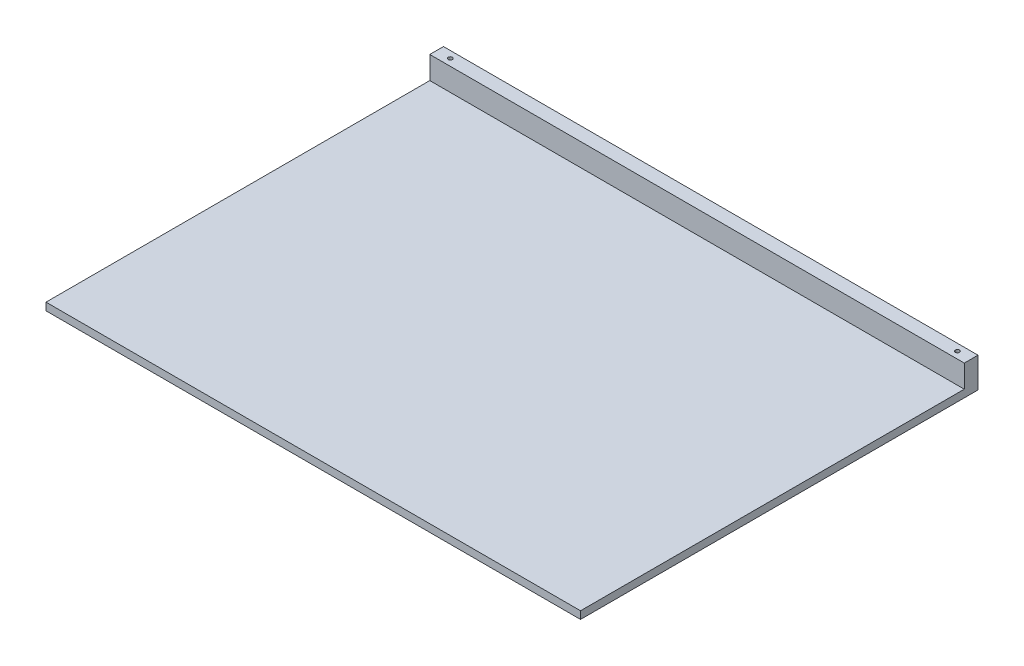
ISO-10303-21;
HEADER;
FILE_DESCRIPTION(('STEP AP214'),'2;1');
FILE_NAME('part.step','',(''),(''),'','','');
FILE_SCHEMA(('AUTOMOTIVE_DESIGN { 1 0 10303 214 1 1 1 1 }'));
ENDSEC;
DATA;
#1=APPLICATION_CONTEXT('core data for automotive mechanical design processes');
#2=APPLICATION_PROTOCOL_DEFINITION('international standard','automotive_design',2000,#1);
#3=PRODUCT_CONTEXT('',#1,'mechanical');
#4=PRODUCT('Part','Part','',(#3));
#5=PRODUCT_RELATED_PRODUCT_CATEGORY('part','',(#4));
#6=PRODUCT_DEFINITION_FORMATION('','',#4);
#7=PRODUCT_DEFINITION_CONTEXT('part definition',#1,'design');
#8=PRODUCT_DEFINITION('design','',#6,#7);
#9=PRODUCT_DEFINITION_SHAPE('','',#8);
#10=(LENGTH_UNIT() NAMED_UNIT(*) SI_UNIT(.MILLI.,.METRE.));
#11=(NAMED_UNIT(*) PLANE_ANGLE_UNIT() SI_UNIT($,.RADIAN.));
#12=(NAMED_UNIT(*) SI_UNIT($,.STERADIAN.) SOLID_ANGLE_UNIT());
#13=UNCERTAINTY_MEASURE_WITH_UNIT(LENGTH_MEASURE(1.E-05),#10,'distance_accuracy_value','');
#14=(GEOMETRIC_REPRESENTATION_CONTEXT(3) GLOBAL_UNCERTAINTY_ASSIGNED_CONTEXT((#13)) GLOBAL_UNIT_ASSIGNED_CONTEXT((#10,
#11,#12)) REPRESENTATION_CONTEXT('',''));
#15=CARTESIAN_POINT('',(0.,0.,0.));
#16=DIRECTION('',(0.,0.,1.));
#17=DIRECTION('',(1.,0.,0.));
#18=AXIS2_PLACEMENT_3D('',#15,#16,#17);
#19=CARTESIAN_POINT('',(195.,5.5,-145.));
#20=DIRECTION('',(-1.,0.,0.));
#21=DIRECTION('',(0.,0.,1.));
#22=AXIS2_PLACEMENT_3D('',#19,#20,#21);
#23=PLANE('',#22);
#24=DIRECTION('',(0.,0.,-1.));
#25=VECTOR('',#24,1.);
#26=CARTESIAN_POINT('',(195.,0.,-145.));
#27=LINE('',#26,#25);
#28=CARTESIAN_POINT('',(195.,0.,425.));
#29=VERTEX_POINT('',#28);
#30=CARTESIAN_POINT('',(195.,0.,135.));
#31=VERTEX_POINT('',#30);
#32=EDGE_CURVE('E122',#29,#31,#27,.T.);
#33=ORIENTED_EDGE('',*,*,#32,.T.);
#34=DIRECTION('',(0.,-1.,0.));
#35=VECTOR('',#34,1.);
#36=CARTESIAN_POINT('',(195.,22.,135.));
#37=LINE('',#36,#35);
#38=CARTESIAN_POINT('',(195.,22.,135.));
#39=VERTEX_POINT('',#38);
#40=EDGE_CURVE('E134',#39,#31,#37,.T.);
#41=ORIENTED_EDGE('',*,*,#40,.F.);
#42=DIRECTION('',(0.,0.,-1.));
#43=VECTOR('',#42,1.);
#44=CARTESIAN_POINT('',(195.,22.,145.));
#45=LINE('',#44,#43);
#46=CARTESIAN_POINT('',(195.,22.,145.));
#47=VERTEX_POINT('',#46);
#48=EDGE_CURVE('E142',#47,#39,#45,.T.);
#49=ORIENTED_EDGE('',*,*,#48,.F.);
#50=DIRECTION('',(0.,-1.,0.));
#51=VECTOR('',#50,1.);
#52=CARTESIAN_POINT('',(195.,5.5,145.));
#53=LINE('',#52,#51);
#54=CARTESIAN_POINT('',(195.,5.5,145.));
#55=VERTEX_POINT('',#54);
#56=EDGE_CURVE('E115',#47,#55,#53,.T.);
#57=ORIENTED_EDGE('',*,*,#56,.T.);
#58=DIRECTION('',(0.,0.,1.));
#59=VECTOR('',#58,1.);
#60=CARTESIAN_POINT('',(195.,5.5,145.));
#61=LINE('',#60,#59);
#62=CARTESIAN_POINT('',(195.,5.5,425.));
#63=VERTEX_POINT('',#62);
#64=EDGE_CURVE('E54',#55,#63,#61,.T.);
#65=ORIENTED_EDGE('',*,*,#64,.T.);
#66=DIRECTION('',(0.,-1.,0.));
#67=VECTOR('',#66,1.);
#68=CARTESIAN_POINT('',(195.,5.5,425.));
#69=LINE('',#68,#67);
#70=EDGE_CURVE('E158',#63,#29,#69,.T.);
#71=ORIENTED_EDGE('',*,*,#70,.T.);
#72=EDGE_LOOP('',(#33,#41,#49,#57,#65,#71));
#73=FACE_BOUND('',#72,.T.);
#74=ADVANCED_FACE('F39',(#73),#23,.F.);
#75=CARTESIAN_POINT('',(-195.,5.5,-145.));
#76=DIRECTION('',(1.,0.,0.));
#77=DIRECTION('',(0.,0.,-1.));
#78=AXIS2_PLACEMENT_3D('',#75,#76,#77);
#79=PLANE('',#78);
#80=DIRECTION('',(0.,-1.,0.));
#81=VECTOR('',#80,1.);
#82=CARTESIAN_POINT('',(-195.,22.,135.));
#83=LINE('',#82,#81);
#84=CARTESIAN_POINT('',(-195.,22.,135.));
#85=VERTEX_POINT('',#84);
#86=CARTESIAN_POINT('',(-195.,0.,135.));
#87=VERTEX_POINT('',#86);
#88=EDGE_CURVE('E137',#85,#87,#83,.T.);
#89=ORIENTED_EDGE('',*,*,#88,.T.);
#90=DIRECTION('',(0.,0.,1.));
#91=VECTOR('',#90,1.);
#92=CARTESIAN_POINT('',(-195.,0.,-145.));
#93=LINE('',#92,#91);
#94=CARTESIAN_POINT('',(-195.,0.,425.));
#95=VERTEX_POINT('',#94);
#96=EDGE_CURVE('E117',#87,#95,#93,.T.);
#97=ORIENTED_EDGE('',*,*,#96,.T.);
#98=DIRECTION('',(0.,-1.,0.));
#99=VECTOR('',#98,1.);
#100=CARTESIAN_POINT('',(-195.,5.5,425.));
#101=LINE('',#100,#99);
#102=CARTESIAN_POINT('',(-195.,5.5,425.));
#103=VERTEX_POINT('',#102);
#104=EDGE_CURVE('E107',#103,#95,#101,.T.);
#105=ORIENTED_EDGE('',*,*,#104,.F.);
#106=DIRECTION('',(0.,0.,-1.));
#107=VECTOR('',#106,1.);
#108=CARTESIAN_POINT('',(-195.,5.5,145.));
#109=LINE('',#108,#107);
#110=CARTESIAN_POINT('',(-195.,5.5,145.));
#111=VERTEX_POINT('',#110);
#112=EDGE_CURVE('E95',#103,#111,#109,.T.);
#113=ORIENTED_EDGE('',*,*,#112,.T.);
#114=DIRECTION('',(0.,-1.,0.));
#115=VECTOR('',#114,1.);
#116=CARTESIAN_POINT('',(-195.,5.5,145.));
#117=LINE('',#116,#115);
#118=CARTESIAN_POINT('',(-195.,22.,145.));
#119=VERTEX_POINT('',#118);
#120=EDGE_CURVE('E47',#119,#111,#117,.T.);
#121=ORIENTED_EDGE('',*,*,#120,.F.);
#122=DIRECTION('',(0.,0.,1.));
#123=VECTOR('',#122,1.);
#124=CARTESIAN_POINT('',(-195.,22.,145.));
#125=LINE('',#124,#123);
#126=EDGE_CURVE('E147',#85,#119,#125,.T.);
#127=ORIENTED_EDGE('',*,*,#126,.F.);
#128=EDGE_LOOP('',(#89,#97,#105,#113,#121,#127));
#129=FACE_BOUND('',#128,.T.);
#130=ADVANCED_FACE('F103',(#129),#79,.F.);
#131=CARTESIAN_POINT('',(-195.,5.5,145.));
#132=DIRECTION('',(0.,0.,-1.));
#133=DIRECTION('',(-1.,0.,0.));
#134=AXIS2_PLACEMENT_3D('',#131,#132,#133);
#135=PLANE('',#134);
#136=ORIENTED_EDGE('',*,*,#120,.T.);
#137=DIRECTION('',(1.,0.,0.));
#138=VECTOR('',#137,1.);
#139=CARTESIAN_POINT('',(-195.,5.5,145.));
#140=LINE('',#139,#138);
#141=EDGE_CURVE('E92',#111,#55,#140,.T.);
#142=ORIENTED_EDGE('',*,*,#141,.T.);
#143=ORIENTED_EDGE('',*,*,#56,.F.);
#144=DIRECTION('',(1.,0.,0.));
#145=VECTOR('',#144,1.);
#146=CARTESIAN_POINT('',(-195.,22.,145.));
#147=LINE('',#146,#145);
#148=EDGE_CURVE('E113',#119,#47,#147,.T.);
#149=ORIENTED_EDGE('',*,*,#148,.F.);
#150=EDGE_LOOP('',(#136,#142,#143,#149));
#151=FACE_BOUND('',#150,.T.);
#152=ADVANCED_FACE('F111',(#151),#135,.F.);
#153=CARTESIAN_POINT('',(185.,-22.5,140.));
#154=DIRECTION('',(0.,1.,0.));
#155=DIRECTION('',(0.,0.,1.));
#156=AXIS2_PLACEMENT_3D('',#153,#154,#155);
#157=CYLINDRICAL_SURFACE('',#156,1.50000000000002);
#158=CARTESIAN_POINT('',(185.,0.,140.));
#159=DIRECTION('',(0.,1.,0.));
#160=DIRECTION('',(0.,0.,1.));
#161=AXIS2_PLACEMENT_3D('',#158,#159,#160);
#162=CIRCLE('',#161,1.50000000000002);
#163=CARTESIAN_POINT('',(185.,0.,141.5));
#164=VERTEX_POINT('',#163);
#165=EDGE_CURVE('E130',#164,#164,#162,.T.);
#166=ORIENTED_EDGE('',*,*,#165,.F.);
#167=EDGE_LOOP('',(#166));
#168=FACE_BOUND('',#167,.T.);
#169=CARTESIAN_POINT('',(185.,22.,140.));
#170=DIRECTION('',(0.,1.,0.));
#171=DIRECTION('',(0.,0.,1.));
#172=AXIS2_PLACEMENT_3D('',#169,#170,#171);
#173=CIRCLE('',#172,1.5);
#174=CARTESIAN_POINT('',(185.,22.,141.5));
#175=VERTEX_POINT('',#174);
#176=EDGE_CURVE('E154',#175,#175,#173,.T.);
#177=ORIENTED_EDGE('',*,*,#176,.T.);
#178=EDGE_LOOP('',(#177));
#179=FACE_BOUND('',#178,.T.);
#180=ADVANCED_FACE('F191',(#168,#179),#157,.F.);
#181=CARTESIAN_POINT('',(-185.,-22.5,140.));
#182=DIRECTION('',(0.,1.,0.));
#183=DIRECTION('',(0.,0.,1.));
#184=AXIS2_PLACEMENT_3D('',#181,#182,#183);
#185=CYLINDRICAL_SURFACE('',#184,1.5);
#186=CARTESIAN_POINT('',(-185.,0.,140.));
#187=DIRECTION('',(0.,1.,0.));
#188=DIRECTION('',(0.,0.,1.));
#189=AXIS2_PLACEMENT_3D('',#186,#187,#188);
#190=CIRCLE('',#189,1.5);
#191=CARTESIAN_POINT('',(-185.,0.,141.5));
#192=VERTEX_POINT('',#191);
#193=EDGE_CURVE('E126',#192,#192,#190,.T.);
#194=ORIENTED_EDGE('',*,*,#193,.F.);
#195=EDGE_LOOP('',(#194));
#196=FACE_BOUND('',#195,.T.);
#197=CARTESIAN_POINT('',(-185.,22.,140.));
#198=DIRECTION('',(0.,1.,0.));
#199=DIRECTION('',(0.,0.,1.));
#200=AXIS2_PLACEMENT_3D('',#197,#198,#199);
#201=CIRCLE('',#200,1.5);
#202=CARTESIAN_POINT('',(-185.,22.,141.5));
#203=VERTEX_POINT('',#202);
#204=EDGE_CURVE('E150',#203,#203,#201,.T.);
#205=ORIENTED_EDGE('',*,*,#204,.T.);
#206=EDGE_LOOP('',(#205));
#207=FACE_BOUND('',#206,.T.);
#208=ADVANCED_FACE('F193',(#196,#207),#185,.F.);
#209=CARTESIAN_POINT('',(0.,0.,0.));
#210=DIRECTION('',(0.,1.,0.));
#211=DIRECTION('',(0.,0.,1.));
#212=AXIS2_PLACEMENT_3D('',#209,#210,#211);
#213=PLANE('',#212);
#214=ORIENTED_EDGE('',*,*,#193,.T.);
#215=EDGE_LOOP('',(#214));
#216=FACE_BOUND('',#215,.T.);
#217=ORIENTED_EDGE('',*,*,#165,.T.);
#218=EDGE_LOOP('',(#217));
#219=FACE_BOUND('',#218,.T.);
#220=ORIENTED_EDGE('',*,*,#96,.F.);
#221=DIRECTION('',(1.,0.,0.));
#222=VECTOR('',#221,1.);
#223=CARTESIAN_POINT('',(0.,0.,135.));
#224=LINE('',#223,#222);
#225=EDGE_CURVE('E11',#87,#31,#224,.T.);
#226=ORIENTED_EDGE('',*,*,#225,.T.);
#227=ORIENTED_EDGE('',*,*,#32,.F.);
#228=DIRECTION('',(-1.,0.,0.));
#229=VECTOR('',#228,1.);
#230=CARTESIAN_POINT('',(-195.,0.,425.));
#231=LINE('',#230,#229);
#232=EDGE_CURVE('E109',#29,#95,#231,.T.);
#233=ORIENTED_EDGE('',*,*,#232,.T.);
#234=EDGE_LOOP('',(#220,#226,#227,#233));
#235=FACE_BOUND('',#234,.T.);
#236=ADVANCED_FACE('F178',(#216,#219,#235),#213,.F.);
#237=CARTESIAN_POINT('',(0.,22.,0.));
#238=DIRECTION('',(0.,-1.,0.));
#239=DIRECTION('',(0.,0.,-1.));
#240=AXIS2_PLACEMENT_3D('',#237,#238,#239);
#241=PLANE('',#240);
#242=ORIENTED_EDGE('',*,*,#126,.T.);
#243=ORIENTED_EDGE('',*,*,#148,.T.);
#244=ORIENTED_EDGE('',*,*,#48,.T.);
#245=DIRECTION('',(-1.,0.,0.));
#246=VECTOR('',#245,1.);
#247=CARTESIAN_POINT('',(-195.,22.,135.));
#248=LINE('',#247,#246);
#249=EDGE_CURVE('E62',#39,#85,#248,.T.);
#250=ORIENTED_EDGE('',*,*,#249,.T.);
#251=EDGE_LOOP('',(#242,#243,#244,#250));
#252=FACE_BOUND('',#251,.T.);
#253=ORIENTED_EDGE('',*,*,#204,.F.);
#254=EDGE_LOOP('',(#253));
#255=FACE_BOUND('',#254,.T.);
#256=ORIENTED_EDGE('',*,*,#176,.F.);
#257=EDGE_LOOP('',(#256));
#258=FACE_BOUND('',#257,.T.);
#259=ADVANCED_FACE('F183',(#252,#255,#258),#241,.F.);
#260=CARTESIAN_POINT('',(-195.,22.,135.));
#261=DIRECTION('',(0.,0.,1.));
#262=DIRECTION('',(1.,0.,0.));
#263=AXIS2_PLACEMENT_3D('',#260,#261,#262);
#264=PLANE('',#263);
#265=ORIENTED_EDGE('',*,*,#40,.T.);
#266=ORIENTED_EDGE('',*,*,#225,.F.);
#267=ORIENTED_EDGE('',*,*,#88,.F.);
#268=ORIENTED_EDGE('',*,*,#249,.F.);
#269=EDGE_LOOP('',(#265,#266,#267,#268));
#270=FACE_BOUND('',#269,.T.);
#271=ADVANCED_FACE('F182',(#270),#264,.F.);
#272=CARTESIAN_POINT('',(-195.,5.5,425.));
#273=DIRECTION('',(0.,0.,1.));
#274=DIRECTION('',(1.,0.,0.));
#275=AXIS2_PLACEMENT_3D('',#272,#273,#274);
#276=PLANE('',#275);
#277=ORIENTED_EDGE('',*,*,#232,.F.);
#278=ORIENTED_EDGE('',*,*,#70,.F.);
#279=DIRECTION('',(-1.,0.,0.));
#280=VECTOR('',#279,1.);
#281=CARTESIAN_POINT('',(-195.,5.5,425.));
#282=LINE('',#281,#280);
#283=EDGE_CURVE('E162',#63,#103,#282,.T.);
#284=ORIENTED_EDGE('',*,*,#283,.T.);
#285=ORIENTED_EDGE('',*,*,#104,.T.);
#286=EDGE_LOOP('',(#277,#278,#284,#285));
#287=FACE_BOUND('',#286,.T.);
#288=ADVANCED_FACE('F175',(#287),#276,.T.);
#289=CARTESIAN_POINT('',(0.,5.5,0.));
#290=DIRECTION('',(0.,1.,0.));
#291=DIRECTION('',(0.,0.,1.));
#292=AXIS2_PLACEMENT_3D('',#289,#290,#291);
#293=PLANE('',#292);
#294=ORIENTED_EDGE('',*,*,#112,.F.);
#295=ORIENTED_EDGE('',*,*,#283,.F.);
#296=ORIENTED_EDGE('',*,*,#64,.F.);
#297=ORIENTED_EDGE('',*,*,#141,.F.);
#298=EDGE_LOOP('',(#294,#295,#296,#297));
#299=FACE_BOUND('',#298,.T.);
#300=ADVANCED_FACE('F94',(#299),#293,.T.);
#301=CLOSED_SHELL('',(#74,#130,#152,#180,#208,#236,#259,#271,#288,#300));
#302=MANIFOLD_SOLID_BREP('B2',#301);
#303=ADVANCED_BREP_SHAPE_REPRESENTATION('',(#18,#302),#14);
#304=SHAPE_DEFINITION_REPRESENTATION(#9,#303);
ENDSEC;
END-ISO-10303-21;
